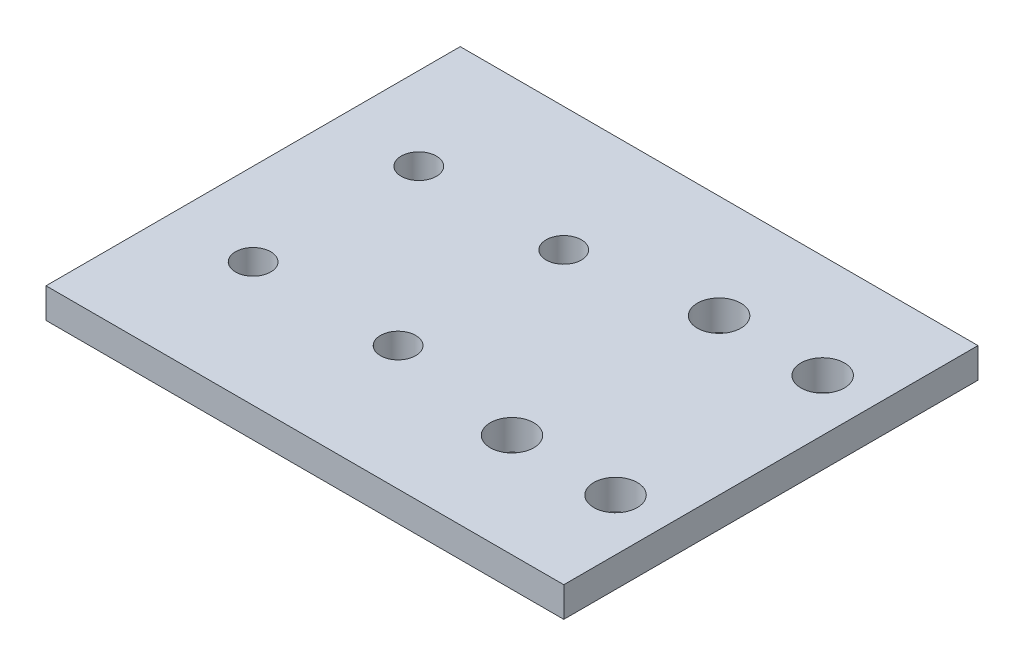
ISO-10303-21;
HEADER;
FILE_DESCRIPTION(('STEP AP214'),'2;1');
FILE_NAME('part.step','',(''),(''),'','','');
FILE_SCHEMA(('AUTOMOTIVE_DESIGN { 1 0 10303 214 1 1 1 1 }'));
ENDSEC;
DATA;
#1=APPLICATION_CONTEXT('core data for automotive mechanical design processes');
#2=APPLICATION_PROTOCOL_DEFINITION('international standard','automotive_design',2000,#1);
#3=PRODUCT_CONTEXT('',#1,'mechanical');
#4=PRODUCT('Part','Part','',(#3));
#5=PRODUCT_RELATED_PRODUCT_CATEGORY('part','',(#4));
#6=PRODUCT_DEFINITION_FORMATION('','',#4);
#7=PRODUCT_DEFINITION_CONTEXT('part definition',#1,'design');
#8=PRODUCT_DEFINITION('design','',#6,#7);
#9=PRODUCT_DEFINITION_SHAPE('','',#8);
#10=(LENGTH_UNIT() NAMED_UNIT(*) SI_UNIT(.MILLI.,.METRE.));
#11=(NAMED_UNIT(*) PLANE_ANGLE_UNIT() SI_UNIT($,.RADIAN.));
#12=(NAMED_UNIT(*) SI_UNIT($,.STERADIAN.) SOLID_ANGLE_UNIT());
#13=UNCERTAINTY_MEASURE_WITH_UNIT(LENGTH_MEASURE(1.E-05),#10,'distance_accuracy_value','');
#14=(GEOMETRIC_REPRESENTATION_CONTEXT(3) GLOBAL_UNCERTAINTY_ASSIGNED_CONTEXT((#13)) GLOBAL_UNIT_ASSIGNED_CONTEXT((#10,
#11,#12)) REPRESENTATION_CONTEXT('',''));
#15=CARTESIAN_POINT('',(0.,0.,0.));
#16=DIRECTION('',(0.,0.,1.));
#17=DIRECTION('',(1.,0.,0.));
#18=AXIS2_PLACEMENT_3D('',#15,#16,#17);
#19=CARTESIAN_POINT('',(0.,2.9,0.));
#20=DIRECTION('',(0.,1.,0.));
#21=DIRECTION('',(0.,0.,1.));
#22=AXIS2_PLACEMENT_3D('',#19,#20,#21);
#23=PLANE('',#22);
#24=CARTESIAN_POINT('',(-25.0000000000003,2.9,-110.));
#25=DIRECTION('',(0.,1.,0.));
#26=DIRECTION('',(0.,0.,1.));
#27=AXIS2_PLACEMENT_3D('',#24,#25,#26);
#28=CIRCLE('',#27,2.10000000000022);
#29=CARTESIAN_POINT('',(-25.0000000000003,2.9,-107.9));
#30=VERTEX_POINT('',#29);
#31=EDGE_CURVE('E342',#30,#30,#28,.T.);
#32=ORIENTED_EDGE('',*,*,#31,.F.);
#33=EDGE_LOOP('',(#32));
#34=FACE_BOUND('',#33,.T.);
#35=CARTESIAN_POINT('',(-35.,2.9,-89.9999999999999));
#36=DIRECTION('',(0.,1.,0.));
#37=DIRECTION('',(0.,0.,1.));
#38=AXIS2_PLACEMENT_3D('',#35,#36,#37);
#39=CIRCLE('',#38,2.1);
#40=CARTESIAN_POINT('',(-35.,2.9,-87.8999999999999));
#41=VERTEX_POINT('',#40);
#42=EDGE_CURVE('E360',#41,#41,#39,.F.);
#43=ORIENTED_EDGE('',*,*,#42,.T.);
#44=EDGE_LOOP('',(#43));
#45=FACE_BOUND('',#44,.T.);
#46=CARTESIAN_POINT('',(-35.,2.9,-110.));
#47=DIRECTION('',(0.,1.,0.));
#48=DIRECTION('',(0.,0.,1.));
#49=AXIS2_PLACEMENT_3D('',#46,#47,#48);
#50=CIRCLE('',#49,2.1);
#51=CARTESIAN_POINT('',(-35.,2.9,-107.9));
#52=VERTEX_POINT('',#51);
#53=EDGE_CURVE('E352',#52,#52,#50,.T.);
#54=ORIENTED_EDGE('',*,*,#53,.F.);
#55=EDGE_LOOP('',(#54));
#56=FACE_BOUND('',#55,.T.);
#57=DIRECTION('',(0.,0.,1.));
#58=VECTOR('',#57,1.);
#59=CARTESIAN_POINT('',(-20.,2.9,0.));
#60=LINE('',#59,#58);
#61=CARTESIAN_POINT('',(-20.,2.9,-120.));
#62=VERTEX_POINT('',#61);
#63=CARTESIAN_POINT('',(-20.,2.9,-80.));
#64=VERTEX_POINT('',#63);
#65=EDGE_CURVE('E108',#62,#64,#60,.T.);
#66=ORIENTED_EDGE('',*,*,#65,.F.);
#67=DIRECTION('',(1.,0.,0.));
#68=VECTOR('',#67,1.);
#69=CARTESIAN_POINT('',(0.,2.9,-120.));
#70=LINE('',#69,#68);
#71=CARTESIAN_POINT('',(-70.,2.9,-120.));
#72=VERTEX_POINT('',#71);
#73=EDGE_CURVE('E98',#72,#62,#70,.T.);
#74=ORIENTED_EDGE('',*,*,#73,.F.);
#75=DIRECTION('',(0.,0.,1.));
#76=VECTOR('',#75,1.);
#77=CARTESIAN_POINT('',(-70.,2.9,0.));
#78=LINE('',#77,#76);
#79=CARTESIAN_POINT('',(-70.,2.9,-80.));
#80=VERTEX_POINT('',#79);
#81=EDGE_CURVE('E103',#72,#80,#78,.T.);
#82=ORIENTED_EDGE('',*,*,#81,.T.);
#83=DIRECTION('',(1.,0.,0.));
#84=VECTOR('',#83,1.);
#85=CARTESIAN_POINT('',(0.,2.9,-80.));
#86=LINE('',#85,#84);
#87=EDGE_CURVE('E65',#80,#64,#86,.T.);
#88=ORIENTED_EDGE('',*,*,#87,.T.);
#89=EDGE_LOOP('',(#66,#74,#82,#88));
#90=FACE_BOUND('',#89,.T.);
#91=CARTESIAN_POINT('',(-62.,2.9,-92.));
#92=DIRECTION('',(0.,1.,0.));
#93=DIRECTION('',(0.,0.,1.));
#94=AXIS2_PLACEMENT_3D('',#91,#92,#93);
#95=CIRCLE('',#94,1.7);
#96=CARTESIAN_POINT('',(-62.,2.9,-90.3));
#97=VERTEX_POINT('',#96);
#98=EDGE_CURVE('E118',#97,#97,#95,.T.);
#99=ORIENTED_EDGE('',*,*,#98,.F.);
#100=EDGE_LOOP('',(#99));
#101=FACE_BOUND('',#100,.T.);
#102=CARTESIAN_POINT('',(-48.,2.9,-108.));
#103=DIRECTION('',(0.,1.,0.));
#104=DIRECTION('',(0.,0.,1.));
#105=AXIS2_PLACEMENT_3D('',#102,#103,#104);
#106=CIRCLE('',#105,1.7);
#107=CARTESIAN_POINT('',(-48.,2.9,-106.3));
#108=VERTEX_POINT('',#107);
#109=EDGE_CURVE('E122',#108,#108,#106,.F.);
#110=ORIENTED_EDGE('',*,*,#109,.T.);
#111=EDGE_LOOP('',(#110));
#112=FACE_BOUND('',#111,.T.);
#113=CARTESIAN_POINT('',(-48.,2.9,-92.));
#114=DIRECTION('',(0.,1.,0.));
#115=DIRECTION('',(0.,0.,1.));
#116=AXIS2_PLACEMENT_3D('',#113,#114,#115);
#117=CIRCLE('',#116,1.7);
#118=CARTESIAN_POINT('',(-48.,2.9,-90.3));
#119=VERTEX_POINT('',#118);
#120=EDGE_CURVE('E126',#119,#119,#117,.T.);
#121=ORIENTED_EDGE('',*,*,#120,.F.);
#122=EDGE_LOOP('',(#121));
#123=FACE_BOUND('',#122,.T.);
#124=CARTESIAN_POINT('',(-62.,2.9,-108.));
#125=DIRECTION('',(0.,1.,0.));
#126=DIRECTION('',(0.,0.,1.));
#127=AXIS2_PLACEMENT_3D('',#124,#125,#126);
#128=CIRCLE('',#127,1.7);
#129=CARTESIAN_POINT('',(-62.,2.9,-106.3));
#130=VERTEX_POINT('',#129);
#131=EDGE_CURVE('E130',#130,#130,#128,.F.);
#132=ORIENTED_EDGE('',*,*,#131,.T.);
#133=EDGE_LOOP('',(#132));
#134=FACE_BOUND('',#133,.T.);
#135=CARTESIAN_POINT('',(-25.,2.9,-90.));
#136=DIRECTION('',(0.,1.,0.));
#137=DIRECTION('',(0.,0.,1.));
#138=AXIS2_PLACEMENT_3D('',#135,#136,#137);
#139=CIRCLE('',#138,2.1);
#140=CARTESIAN_POINT('',(-25.,2.9,-87.9));
#141=VERTEX_POINT('',#140);
#142=EDGE_CURVE('E346',#141,#141,#139,.F.);
#143=ORIENTED_EDGE('',*,*,#142,.T.);
#144=EDGE_LOOP('',(#143));
#145=FACE_BOUND('',#144,.T.);
#146=ADVANCED_FACE('F47',(#34,#45,#56,#90,#101,#112,#123,#134,#145),#23,.T.);
#147=CARTESIAN_POINT('',(0.,0.,0.));
#148=DIRECTION('',(0.,1.,0.));
#149=DIRECTION('',(0.,0.,1.));
#150=AXIS2_PLACEMENT_3D('',#147,#148,#149);
#151=PLANE('',#150);
#152=CARTESIAN_POINT('',(-25.0000000000003,0.,-110.));
#153=DIRECTION('',(0.,1.,0.));
#154=DIRECTION('',(0.,0.,1.));
#155=AXIS2_PLACEMENT_3D('',#152,#153,#154);
#156=CIRCLE('',#155,2.10000000000022);
#157=CARTESIAN_POINT('',(-25.0000000000003,0.,-107.9));
#158=VERTEX_POINT('',#157);
#159=EDGE_CURVE('E340',#158,#158,#156,.T.);
#160=ORIENTED_EDGE('',*,*,#159,.T.);
#161=EDGE_LOOP('',(#160));
#162=FACE_BOUND('',#161,.T.);
#163=CARTESIAN_POINT('',(-35.,0.,-110.));
#164=DIRECTION('',(0.,1.,0.));
#165=DIRECTION('',(0.,0.,1.));
#166=AXIS2_PLACEMENT_3D('',#163,#164,#165);
#167=CIRCLE('',#166,2.1);
#168=CARTESIAN_POINT('',(-35.,0.,-107.9));
#169=VERTEX_POINT('',#168);
#170=EDGE_CURVE('E138',#169,#169,#167,.T.);
#171=ORIENTED_EDGE('',*,*,#170,.T.);
#172=EDGE_LOOP('',(#171));
#173=FACE_BOUND('',#172,.T.);
#174=DIRECTION('',(0.,0.,1.));
#175=VECTOR('',#174,1.);
#176=CARTESIAN_POINT('',(-20.,0.,0.));
#177=LINE('',#176,#175);
#178=CARTESIAN_POINT('',(-20.,0.,-120.));
#179=VERTEX_POINT('',#178);
#180=CARTESIAN_POINT('',(-20.,0.,-80.));
#181=VERTEX_POINT('',#180);
#182=EDGE_CURVE('E134',#179,#181,#177,.T.);
#183=ORIENTED_EDGE('',*,*,#182,.T.);
#184=DIRECTION('',(1.,0.,0.));
#185=VECTOR('',#184,1.);
#186=CARTESIAN_POINT('',(0.,0.,-80.));
#187=LINE('',#186,#185);
#188=CARTESIAN_POINT('',(-70.,0.,-80.));
#189=VERTEX_POINT('',#188);
#190=EDGE_CURVE('E143',#189,#181,#187,.T.);
#191=ORIENTED_EDGE('',*,*,#190,.F.);
#192=DIRECTION('',(0.,0.,1.));
#193=VECTOR('',#192,1.);
#194=CARTESIAN_POINT('',(-70.,0.,0.));
#195=LINE('',#194,#193);
#196=CARTESIAN_POINT('',(-70.,0.,-120.));
#197=VERTEX_POINT('',#196);
#198=EDGE_CURVE('E80',#197,#189,#195,.T.);
#199=ORIENTED_EDGE('',*,*,#198,.F.);
#200=DIRECTION('',(1.,0.,0.));
#201=VECTOR('',#200,1.);
#202=CARTESIAN_POINT('',(0.,0.,-120.));
#203=LINE('',#202,#201);
#204=EDGE_CURVE('E100',#197,#179,#203,.T.);
#205=ORIENTED_EDGE('',*,*,#204,.T.);
#206=EDGE_LOOP('',(#183,#191,#199,#205));
#207=FACE_BOUND('',#206,.T.);
#208=CARTESIAN_POINT('',(-62.,0.,-92.));
#209=DIRECTION('',(0.,1.,0.));
#210=DIRECTION('',(0.,0.,1.));
#211=AXIS2_PLACEMENT_3D('',#208,#209,#210);
#212=CIRCLE('',#211,1.7);
#213=CARTESIAN_POINT('',(-62.,0.,-90.3));
#214=VERTEX_POINT('',#213);
#215=EDGE_CURVE('E146',#214,#214,#212,.T.);
#216=ORIENTED_EDGE('',*,*,#215,.T.);
#217=EDGE_LOOP('',(#216));
#218=FACE_BOUND('',#217,.T.);
#219=CARTESIAN_POINT('',(-48.,0.,-108.));
#220=DIRECTION('',(0.,1.,0.));
#221=DIRECTION('',(0.,0.,1.));
#222=AXIS2_PLACEMENT_3D('',#219,#220,#221);
#223=CIRCLE('',#222,1.7);
#224=CARTESIAN_POINT('',(-48.,0.,-106.3));
#225=VERTEX_POINT('',#224);
#226=EDGE_CURVE('E150',#225,#225,#223,.F.);
#227=ORIENTED_EDGE('',*,*,#226,.F.);
#228=EDGE_LOOP('',(#227));
#229=FACE_BOUND('',#228,.T.);
#230=CARTESIAN_POINT('',(-48.,0.,-92.));
#231=DIRECTION('',(0.,1.,0.));
#232=DIRECTION('',(0.,0.,1.));
#233=AXIS2_PLACEMENT_3D('',#230,#231,#232);
#234=CIRCLE('',#233,1.7);
#235=CARTESIAN_POINT('',(-48.,0.,-90.3));
#236=VERTEX_POINT('',#235);
#237=EDGE_CURVE('E154',#236,#236,#234,.T.);
#238=ORIENTED_EDGE('',*,*,#237,.T.);
#239=EDGE_LOOP('',(#238));
#240=FACE_BOUND('',#239,.T.);
#241=CARTESIAN_POINT('',(-62.,0.,-108.));
#242=DIRECTION('',(0.,1.,0.));
#243=DIRECTION('',(0.,0.,1.));
#244=AXIS2_PLACEMENT_3D('',#241,#242,#243);
#245=CIRCLE('',#244,1.7);
#246=CARTESIAN_POINT('',(-62.,0.,-106.3));
#247=VERTEX_POINT('',#246);
#248=EDGE_CURVE('E112',#247,#247,#245,.F.);
#249=ORIENTED_EDGE('',*,*,#248,.F.);
#250=EDGE_LOOP('',(#249));
#251=FACE_BOUND('',#250,.T.);
#252=CARTESIAN_POINT('',(-35.,0.,-89.9999999999999));
#253=DIRECTION('',(0.,1.,0.));
#254=DIRECTION('',(0.,0.,1.));
#255=AXIS2_PLACEMENT_3D('',#252,#253,#254);
#256=CIRCLE('',#255,2.1);
#257=CARTESIAN_POINT('',(-35.,0.,-87.8999999999999));
#258=VERTEX_POINT('',#257);
#259=EDGE_CURVE('E355',#258,#258,#256,.F.);
#260=ORIENTED_EDGE('',*,*,#259,.F.);
#261=EDGE_LOOP('',(#260));
#262=FACE_BOUND('',#261,.T.);
#263=CARTESIAN_POINT('',(-25.,0.,-90.));
#264=DIRECTION('',(0.,1.,0.));
#265=DIRECTION('',(0.,0.,1.));
#266=AXIS2_PLACEMENT_3D('',#263,#264,#265);
#267=CIRCLE('',#266,2.1);
#268=CARTESIAN_POINT('',(-25.,0.,-87.9));
#269=VERTEX_POINT('',#268);
#270=EDGE_CURVE('E365',#269,#269,#267,.F.);
#271=ORIENTED_EDGE('',*,*,#270,.F.);
#272=EDGE_LOOP('',(#271));
#273=FACE_BOUND('',#272,.T.);
#274=ADVANCED_FACE('F168',(#162,#173,#207,#218,#229,#240,#251,#262,#273),#151,.F.);
#275=CARTESIAN_POINT('',(-20.,2.9,0.));
#276=DIRECTION('',(1.,0.,0.));
#277=DIRECTION('',(0.,0.,-1.));
#278=AXIS2_PLACEMENT_3D('',#275,#276,#277);
#279=PLANE('',#278);
#280=ORIENTED_EDGE('',*,*,#182,.F.);
#281=DIRECTION('',(0.,-1.,0.));
#282=VECTOR('',#281,1.);
#283=CARTESIAN_POINT('',(-20.,2.9,-120.));
#284=LINE('',#283,#282);
#285=EDGE_CURVE('E11',#62,#179,#284,.T.);
#286=ORIENTED_EDGE('',*,*,#285,.F.);
#287=ORIENTED_EDGE('',*,*,#65,.T.);
#288=DIRECTION('',(0.,-1.,0.));
#289=VECTOR('',#288,1.);
#290=CARTESIAN_POINT('',(-20.,2.9,-80.));
#291=LINE('',#290,#289);
#292=EDGE_CURVE('E87',#64,#181,#291,.T.);
#293=ORIENTED_EDGE('',*,*,#292,.T.);
#294=EDGE_LOOP('',(#280,#286,#287,#293));
#295=FACE_BOUND('',#294,.T.);
#296=ADVANCED_FACE('F49',(#295),#279,.T.);
#297=CARTESIAN_POINT('',(0.,2.9,-120.));
#298=DIRECTION('',(0.,0.,-1.));
#299=DIRECTION('',(-1.,0.,0.));
#300=AXIS2_PLACEMENT_3D('',#297,#298,#299);
#301=PLANE('',#300);
#302=ORIENTED_EDGE('',*,*,#204,.F.);
#303=DIRECTION('',(0.,-1.,0.));
#304=VECTOR('',#303,1.);
#305=CARTESIAN_POINT('',(-70.,2.9,-120.));
#306=LINE('',#305,#304);
#307=EDGE_CURVE('E57',#72,#197,#306,.T.);
#308=ORIENTED_EDGE('',*,*,#307,.F.);
#309=ORIENTED_EDGE('',*,*,#73,.T.);
#310=ORIENTED_EDGE('',*,*,#285,.T.);
#311=EDGE_LOOP('',(#302,#308,#309,#310));
#312=FACE_BOUND('',#311,.T.);
#313=ADVANCED_FACE('F96',(#312),#301,.T.);
#314=CARTESIAN_POINT('',(-70.,2.9,0.));
#315=DIRECTION('',(1.,0.,0.));
#316=DIRECTION('',(0.,0.,-1.));
#317=AXIS2_PLACEMENT_3D('',#314,#315,#316);
#318=PLANE('',#317);
#319=ORIENTED_EDGE('',*,*,#198,.T.);
#320=DIRECTION('',(0.,-1.,0.));
#321=VECTOR('',#320,1.);
#322=CARTESIAN_POINT('',(-70.,2.9,-80.));
#323=LINE('',#322,#321);
#324=EDGE_CURVE('E102',#80,#189,#323,.T.);
#325=ORIENTED_EDGE('',*,*,#324,.F.);
#326=ORIENTED_EDGE('',*,*,#81,.F.);
#327=ORIENTED_EDGE('',*,*,#307,.T.);
#328=EDGE_LOOP('',(#319,#325,#326,#327));
#329=FACE_BOUND('',#328,.T.);
#330=ADVANCED_FACE('F104',(#329),#318,.F.);
#331=CARTESIAN_POINT('',(-48.,2.9,-92.));
#332=DIRECTION('',(0.,-1.,0.));
#333=DIRECTION('',(0.,0.,-1.));
#334=AXIS2_PLACEMENT_3D('',#331,#332,#333);
#335=CYLINDRICAL_SURFACE('',#334,1.7);
#336=ORIENTED_EDGE('',*,*,#120,.T.);
#337=EDGE_LOOP('',(#336));
#338=FACE_BOUND('',#337,.T.);
#339=ORIENTED_EDGE('',*,*,#237,.F.);
#340=EDGE_LOOP('',(#339));
#341=FACE_BOUND('',#340,.T.);
#342=ADVANCED_FACE('F192',(#338,#341),#335,.F.);
#343=CARTESIAN_POINT('',(-48.,2.9,-108.));
#344=DIRECTION('',(0.,-1.,0.));
#345=DIRECTION('',(0.,0.,-1.));
#346=AXIS2_PLACEMENT_3D('',#343,#344,#345);
#347=CYLINDRICAL_SURFACE('',#346,1.7);
#348=ORIENTED_EDGE('',*,*,#109,.F.);
#349=EDGE_LOOP('',(#348));
#350=FACE_BOUND('',#349,.T.);
#351=ORIENTED_EDGE('',*,*,#226,.T.);
#352=EDGE_LOOP('',(#351));
#353=FACE_BOUND('',#352,.T.);
#354=ADVANCED_FACE('F195',(#350,#353),#347,.F.);
#355=CARTESIAN_POINT('',(-62.,2.9,-92.));
#356=DIRECTION('',(0.,-1.,0.));
#357=DIRECTION('',(0.,0.,-1.));
#358=AXIS2_PLACEMENT_3D('',#355,#356,#357);
#359=CYLINDRICAL_SURFACE('',#358,1.7);
#360=ORIENTED_EDGE('',*,*,#98,.T.);
#361=EDGE_LOOP('',(#360));
#362=FACE_BOUND('',#361,.T.);
#363=ORIENTED_EDGE('',*,*,#215,.F.);
#364=EDGE_LOOP('',(#363));
#365=FACE_BOUND('',#364,.T.);
#366=ADVANCED_FACE('F199',(#362,#365),#359,.F.);
#367=CARTESIAN_POINT('',(0.,2.9,-80.));
#368=DIRECTION('',(0.,0.,-1.));
#369=DIRECTION('',(-1.,0.,0.));
#370=AXIS2_PLACEMENT_3D('',#367,#368,#369);
#371=PLANE('',#370);
#372=ORIENTED_EDGE('',*,*,#190,.T.);
#373=ORIENTED_EDGE('',*,*,#292,.F.);
#374=ORIENTED_EDGE('',*,*,#87,.F.);
#375=ORIENTED_EDGE('',*,*,#324,.T.);
#376=EDGE_LOOP('',(#372,#373,#374,#375));
#377=FACE_BOUND('',#376,.T.);
#378=ADVANCED_FACE('F166',(#377),#371,.F.);
#379=CARTESIAN_POINT('',(-62.,2.9,-108.));
#380=DIRECTION('',(0.,-1.,0.));
#381=DIRECTION('',(0.,0.,-1.));
#382=AXIS2_PLACEMENT_3D('',#379,#380,#381);
#383=CYLINDRICAL_SURFACE('',#382,1.7);
#384=ORIENTED_EDGE('',*,*,#131,.F.);
#385=EDGE_LOOP('',(#384));
#386=FACE_BOUND('',#385,.T.);
#387=ORIENTED_EDGE('',*,*,#248,.T.);
#388=EDGE_LOOP('',(#387));
#389=FACE_BOUND('',#388,.T.);
#390=ADVANCED_FACE('F189',(#386,#389),#383,.F.);
#391=CARTESIAN_POINT('',(-35.,0.,-110.));
#392=DIRECTION('',(0.,1.,0.));
#393=DIRECTION('',(0.,0.,1.));
#394=AXIS2_PLACEMENT_3D('',#391,#392,#393);
#395=CYLINDRICAL_SURFACE('',#394,2.1);
#396=ORIENTED_EDGE('',*,*,#170,.F.);
#397=EDGE_LOOP('',(#396));
#398=FACE_BOUND('',#397,.T.);
#399=ORIENTED_EDGE('',*,*,#53,.T.);
#400=EDGE_LOOP('',(#399));
#401=FACE_BOUND('',#400,.T.);
#402=ADVANCED_FACE('F186',(#398,#401),#395,.F.);
#403=CARTESIAN_POINT('',(-35.,0.,-89.9999999999999));
#404=DIRECTION('',(0.,1.,0.));
#405=DIRECTION('',(0.,0.,1.));
#406=AXIS2_PLACEMENT_3D('',#403,#404,#405);
#407=CYLINDRICAL_SURFACE('',#406,2.1);
#408=ORIENTED_EDGE('',*,*,#259,.T.);
#409=EDGE_LOOP('',(#408));
#410=FACE_BOUND('',#409,.T.);
#411=ORIENTED_EDGE('',*,*,#42,.F.);
#412=EDGE_LOOP('',(#411));
#413=FACE_BOUND('',#412,.T.);
#414=ADVANCED_FACE('F306',(#410,#413),#407,.F.);
#415=CARTESIAN_POINT('',(-25.,0.,-90.));
#416=DIRECTION('',(0.,1.,0.));
#417=DIRECTION('',(0.,0.,1.));
#418=AXIS2_PLACEMENT_3D('',#415,#416,#417);
#419=CYLINDRICAL_SURFACE('',#418,2.1);
#420=ORIENTED_EDGE('',*,*,#270,.T.);
#421=EDGE_LOOP('',(#420));
#422=FACE_BOUND('',#421,.T.);
#423=ORIENTED_EDGE('',*,*,#142,.F.);
#424=EDGE_LOOP('',(#423));
#425=FACE_BOUND('',#424,.T.);
#426=ADVANCED_FACE('F315',(#422,#425),#419,.F.);
#427=CARTESIAN_POINT('',(-25.0000000000003,0.,-110.));
#428=DIRECTION('',(0.,1.,0.));
#429=DIRECTION('',(0.,0.,1.));
#430=AXIS2_PLACEMENT_3D('',#427,#428,#429);
#431=CYLINDRICAL_SURFACE('',#430,2.10000000000022);
#432=ORIENTED_EDGE('',*,*,#159,.F.);
#433=EDGE_LOOP('',(#432));
#434=FACE_BOUND('',#433,.T.);
#435=ORIENTED_EDGE('',*,*,#31,.T.);
#436=EDGE_LOOP('',(#435));
#437=FACE_BOUND('',#436,.T.);
#438=ADVANCED_FACE('F325',(#434,#437),#431,.F.);
#439=CLOSED_SHELL('',(#146,#274,#296,#313,#330,#342,#354,#366,#378,#390,#402,#414,#426,#438));
#440=MANIFOLD_SOLID_BREP('B2',#439);
#441=ADVANCED_BREP_SHAPE_REPRESENTATION('',(#18,#440),#14);
#442=SHAPE_DEFINITION_REPRESENTATION(#9,#441);
ENDSEC;
END-ISO-10303-21;
